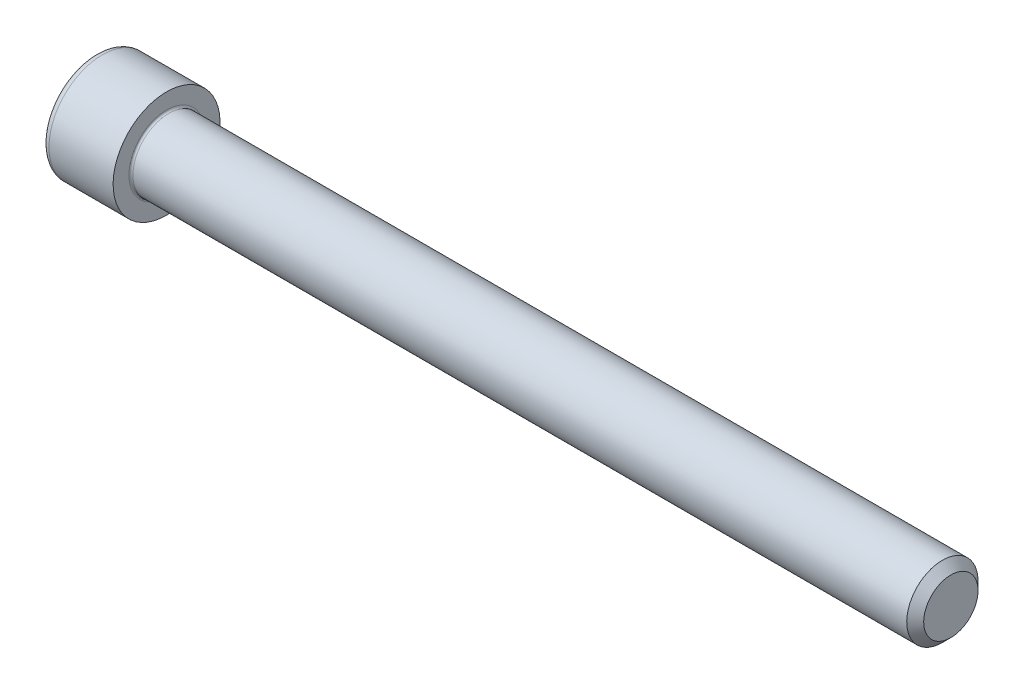
ISO-10303-21;
HEADER;
FILE_DESCRIPTION(('STEP AP214'),'2;1');
FILE_NAME('part.step','',(''),(''),'','','');
FILE_SCHEMA(('AUTOMOTIVE_DESIGN { 1 0 10303 214 1 1 1 1 }'));
ENDSEC;
DATA;
#1=APPLICATION_CONTEXT('core data for automotive mechanical design processes');
#2=APPLICATION_PROTOCOL_DEFINITION('international standard','automotive_design',2000,#1);
#3=PRODUCT_CONTEXT('',#1,'mechanical');
#4=PRODUCT('Part','Part','',(#3));
#5=PRODUCT_RELATED_PRODUCT_CATEGORY('part','',(#4));
#6=PRODUCT_DEFINITION_FORMATION('','',#4);
#7=PRODUCT_DEFINITION_CONTEXT('part definition',#1,'design');
#8=PRODUCT_DEFINITION('design','',#6,#7);
#9=PRODUCT_DEFINITION_SHAPE('','',#8);
#10=(LENGTH_UNIT() NAMED_UNIT(*) SI_UNIT(.MILLI.,.METRE.));
#11=(NAMED_UNIT(*) PLANE_ANGLE_UNIT() SI_UNIT($,.RADIAN.));
#12=(NAMED_UNIT(*) SI_UNIT($,.STERADIAN.) SOLID_ANGLE_UNIT());
#13=UNCERTAINTY_MEASURE_WITH_UNIT(LENGTH_MEASURE(1.E-05),#10,'distance_accuracy_value','');
#14=(GEOMETRIC_REPRESENTATION_CONTEXT(3) GLOBAL_UNCERTAINTY_ASSIGNED_CONTEXT((#13)) GLOBAL_UNIT_ASSIGNED_CONTEXT((#10,
#11,#12)) REPRESENTATION_CONTEXT('',''));
#15=CARTESIAN_POINT('',(0.,0.,0.));
#16=DIRECTION('',(0.,0.,1.));
#17=DIRECTION('',(1.,0.,0.));
#18=AXIS2_PLACEMENT_3D('',#15,#16,#17);
#19=CARTESIAN_POINT('',(-3.302,0.,0.));
#20=DIRECTION('',(-1.,0.,0.));
#21=DIRECTION('',(0.,-1.,0.));
#22=AXIS2_PLACEMENT_3D('',#19,#20,#21);
#23=CONICAL_SURFACE('',#22,2.7569630054343,1.0471975511966);
#24=CARTESIAN_POINT('',(-1.71026666666666,0.,0.));
#25=VERTEX_POINT('',#24);
#26=VERTEX_LOOP('',#25);
#27=FACE_BOUND('',#26,.T.);
#28=CARTESIAN_POINT('',(-3.30206667085508,0.000200000000867156,2.75707847548864));
#29=CARTESIAN_POINT('',(-3.26707753696997,-0.104723935463511,2.69650061310385));
#30=CARTESIAN_POINT('',(-3.23525591461342,-0.210553565392693,2.63539984777599));
#31=CARTESIAN_POINT('',(-3.17971030909154,-0.424045469619761,2.51214023940069));
#32=CARTESIAN_POINT('',(-3.15600597703154,-0.531711538058903,2.44997920580476));
#33=CARTESIAN_POINT('',(-3.11910584905487,-0.745709321958978,2.32642752766407));
#34=CARTESIAN_POINT('',(-3.10566447822801,-0.852008106597351,2.26505589573858));
#35=CARTESIAN_POINT('',(-3.089616747602,-1.06510598253905,2.1420237796999));
#36=CARTESIAN_POINT('',(-3.08699710051458,-1.17190429901638,2.08036374293272));
#37=CARTESIAN_POINT('',(-3.09243976092166,-1.37147185730919,1.96514335943084));
#38=CARTESIAN_POINT('',(-3.09916570852553,-1.46427093659247,1.91156578602609));
#39=CARTESIAN_POINT('',(-3.12048522514207,-1.64926449459352,1.80475970551584));
#40=CARTESIAN_POINT('',(-3.1350860806402,-1.74145833320245,1.75153156797735));
#41=CARTESIAN_POINT('',(-3.17158795953627,-1.92683347580783,1.64450517949307));
#42=CARTESIAN_POINT('',(-3.19364375098412,-2.01999131129759,1.59072047809594));
#43=CARTESIAN_POINT('',(-3.24370205803594,-2.20491735878378,1.48395337479961));
#44=CARTESIAN_POINT('',(-3.27169280762563,-2.29668794093019,1.43096960449369));
#45=CARTESIAN_POINT('',(-3.30206667085479,-2.3878,1.37836603266331));
#46=B_SPLINE_CURVE_WITH_KNOTS('',3,(#28,#29,#30,#31,#32,#33,#34,#35,#36,#37,#38,#39,#40,#41,#42,
#43,#44,#45),.UNSPECIFIED.,.F.,.F.,(4,2,2,2,2,2,2,2,4),(0.,0.378469527554716,0.757848917720246,
1.12783830118166,1.49737326355531,1.81916504067657,2.14125507699957,2.47049068028452,
2.79907957904392),.UNSPECIFIED.);
#47=CARTESIAN_POINT('',(-3.30200000001923,0.,2.7569630054343));
#48=VERTEX_POINT('',#47);
#49=CARTESIAN_POINT('',(-3.30200000001923,-2.3876,1.37848150271715));
#50=VERTEX_POINT('',#49);
#51=EDGE_CURVE('E132',#48,#50,#46,.T.);
#52=ORIENTED_EDGE('',*,*,#51,.F.);
#53=CARTESIAN_POINT('',(-3.30206667085508,2.38780000000087,1.37836603266281));
#54=CARTESIAN_POINT('',(-3.26707753696997,2.28287606453649,1.4389438950476));
#55=CARTESIAN_POINT('',(-3.23525591461342,2.17704643460731,1.50004466037545));
#56=CARTESIAN_POINT('',(-3.17971030909154,1.96355453038024,1.62330426875076));
#57=CARTESIAN_POINT('',(-3.15600597703154,1.8558884619411,1.68546530234669));
#58=CARTESIAN_POINT('',(-3.11910584905487,1.64189067804102,1.80901698048738));
#59=CARTESIAN_POINT('',(-3.10566447822801,1.53559189340265,1.87038861241287));
#60=CARTESIAN_POINT('',(-3.089616747602,1.32249401746096,1.99342072845155));
#61=CARTESIAN_POINT('',(-3.08699710051457,1.21569570098362,2.05508076521873));
#62=CARTESIAN_POINT('',(-3.09243976092166,1.01612814269081,2.17030114872061));
#63=CARTESIAN_POINT('',(-3.09916570852553,0.92332906340753,2.22387872212536));
#64=CARTESIAN_POINT('',(-3.12048522514207,0.738335505406479,2.33068480263561));
#65=CARTESIAN_POINT('',(-3.1350860806402,0.64614166679755,2.3839129401741));
#66=CARTESIAN_POINT('',(-3.17158795953627,0.460766524192175,2.49093932865838));
#67=CARTESIAN_POINT('',(-3.19364375098412,0.367608688702416,2.54472403005552));
#68=CARTESIAN_POINT('',(-3.24370205803594,0.182682641216218,2.65149113335185));
#69=CARTESIAN_POINT('',(-3.27169280762563,0.090912059069809,2.70447490365776));
#70=CARTESIAN_POINT('',(-3.30206667085479,-0.000200000000000247,2.75707847548814));
#71=B_SPLINE_CURVE_WITH_KNOTS('',3,(#53,#54,#55,#56,#57,#58,#59,#60,#61,#62,#63,#64,#65,#66,#67,
#68,#69,#70),.UNSPECIFIED.,.F.,.F.,(4,2,2,2,2,2,2,2,4),(0.,0.378469527554716,0.757848917720246,
1.12783830118166,1.49737326355531,1.81916504067657,2.14125507699957,2.47049068028452,
2.79907957904392),.UNSPECIFIED.);
#72=CARTESIAN_POINT('',(-3.30200000001923,2.3876,1.37848150271715));
#73=VERTEX_POINT('',#72);
#74=EDGE_CURVE('E116',#73,#48,#71,.T.);
#75=ORIENTED_EDGE('',*,*,#74,.F.);
#76=CARTESIAN_POINT('',(-4.18979393601053,2.3876,-3.56980849321916));
#77=CARTESIAN_POINT('',(-4.14032815892822,2.3876,-3.46670370248887));
#78=CARTESIAN_POINT('',(-4.09137617294275,2.3876,-3.36334773439772));
#79=CARTESIAN_POINT('',(-3.99479124822564,2.3876,-3.15599957257146));
#80=CARTESIAN_POINT('',(-3.94715854687756,2.3876,-3.05200726839556));
#81=CARTESIAN_POINT('',(-3.85323755548223,2.3876,-2.84265630190438));
#82=CARTESIAN_POINT('',(-3.80695917341202,2.3876,-2.73729317779475));
#83=CARTESIAN_POINT('',(-3.7164776477105,2.3876,-2.52568279122074));
#84=CARTESIAN_POINT('',(-3.67227439617584,2.3876,-2.41943557506663));
#85=CARTESIAN_POINT('',(-3.58537011973026,2.3876,-2.20308925723332));
#86=CARTESIAN_POINT('',(-3.54273858869362,2.3876,-2.09296207559753));
#87=CARTESIAN_POINT('',(-3.46101994745047,2.3876,-1.8713756399522));
#88=CARTESIAN_POINT('',(-3.42193324834409,2.3876,-1.75991623313437));
#89=CARTESIAN_POINT('',(-3.34842202238522,2.3876,-1.53574546818942));
#90=CARTESIAN_POINT('',(-3.3139867136315,2.3876,-1.42303768420966));
#91=CARTESIAN_POINT('',(-3.2509559036791,2.3876,-1.19600683622336));
#92=CARTESIAN_POINT('',(-3.22235895212225,2.3876,-1.08168418094485));
#93=CARTESIAN_POINT('',(-3.17252928890006,2.3876,-0.851661734027283));
#94=CARTESIAN_POINT('',(-3.15128145205012,2.3876,-0.735965283877574));
#95=CARTESIAN_POINT('',(-3.11754136315291,2.3876,-0.50327798756284));
#96=CARTESIAN_POINT('',(-3.10504851942715,2.3876,-0.386287229412431));
#97=CARTESIAN_POINT('',(-3.08997750794679,2.3876,-0.153060820709619));
#98=CARTESIAN_POINT('',(-3.08728234032656,2.3876,-0.0368329177291807));
#99=CARTESIAN_POINT('',(-3.09173437046107,2.3876,0.195441211734905));
#100=CARTESIAN_POINT('',(-3.09888217765583,2.3876,0.311487426523707));
#101=CARTESIAN_POINT('',(-3.11929953408256,2.3876,0.512427197188795));
#102=CARTESIAN_POINT('',(-3.13048322640562,2.3876,0.597542928135904));
#103=CARTESIAN_POINT('',(-3.15737658155532,2.3876,0.767062617315261));
#104=CARTESIAN_POINT('',(-3.1730870275181,2.3876,0.851466449785058));
#105=CARTESIAN_POINT('',(-3.22617759497026,2.3876,1.10356659989913));
#106=CARTESIAN_POINT('',(-3.26950195890938,2.3876,1.27002026330531));
#107=CARTESIAN_POINT('',(-3.34351951443674,2.3876,1.51891846693128));
#108=CARTESIAN_POINT('',(-3.37004247651047,2.3876,1.60267504477745));
#109=CARTESIAN_POINT('',(-3.42554115129612,2.3876,1.76932116385018));
#110=CARTESIAN_POINT('',(-3.45451533329899,2.3876,1.85221121038454));
#111=CARTESIAN_POINT('',(-3.51449661718128,2.3876,2.01722886079907));
#112=CARTESIAN_POINT('',(-3.54550334960868,2.3876,2.09935660016091));
#113=CARTESIAN_POINT('',(-3.60921387627046,2.3876,2.26296537207273));
#114=CARTESIAN_POINT('',(-3.64191795723008,2.3876,2.34444629266071));
#115=CARTESIAN_POINT('',(-3.72749222624701,2.3876,2.55242893230761));
#116=CARTESIAN_POINT('',(-3.78137257985246,2.3876,2.67851448309363));
#117=CARTESIAN_POINT('',(-3.89172540006839,2.3876,2.92954963732601));
#118=CARTESIAN_POINT('',(-3.94819806086299,2.3876,3.05449915483192));
#119=CARTESIAN_POINT('',(-4.06314681218863,2.3876,3.30349712860238));
#120=CARTESIAN_POINT('',(-4.12162325025623,2.3876,3.42754542399002));
#121=CARTESIAN_POINT('',(-4.24013780231262,2.3876,3.6748949368526));
#122=CARTESIAN_POINT('',(-4.30017595103082,2.3876,3.79819613763829));
#123=CARTESIAN_POINT('',(-4.48227324944979,2.3876,4.16748745488007));
#124=CARTESIAN_POINT('',(-4.60617582250528,2.3876,4.41256771633377));
#125=CARTESIAN_POINT('',(-4.85714973382894,2.3876,4.90105019175773));
#126=CARTESIAN_POINT('',(-4.98422066930818,2.3876,5.14445261405766));
#127=CARTESIAN_POINT('',(-5.22846408211094,2.38760000000001,5.60717601476413));
#128=CARTESIAN_POINT('',(-5.34543879972904,2.38760000000001,5.82660154635425));
#129=CARTESIAN_POINT('',(-5.58072000325182,2.38760000000001,6.26474684956248));
#130=CARTESIAN_POINT('',(-5.69902653844135,2.38760000000001,6.48346659467455));
#131=CARTESIAN_POINT('',(-5.93633623854322,2.38760000000001,6.91980663495284));
#132=CARTESIAN_POINT('',(-6.05533686617889,2.38760000000001,7.13742831158591));
#133=CARTESIAN_POINT('',(-6.29411264362597,2.38760000000001,7.57223168560478));
#134=CARTESIAN_POINT('',(-6.41388775257905,2.38760000000001,7.78941340541968));
#135=CARTESIAN_POINT('',(-6.53394673725325,2.38760000000001,8.00643706714307));
#136=B_SPLINE_CURVE_WITH_KNOTS('',3,(#76,#77,#78,#79,#80,#81,#82,#83,#84,#85,#86,#87,#88,#89,
#90,#91,#92,#93,#94,#95,#96,#97,#98,#99,#100,#101,#102,#103,#104,#105,#106,#107,#108,#109,#110,
#111,#112,#113,#114,#115,#116,#117,#118,#119,#120,#121,#122,#123,#124,#125,#126,#127,#128,#129,
#130,#131,#132,#133,#134,#135),.UNSPECIFIED.,.F.,.F.,(4,2,2,2,2,2,2,2,2,2,2,2,2,2,2,2,2,2,2,2,2,
2,2,2,2,2,2,2,2,4),(0.,0.343075057157598,0.686211449189029,1.03142931875567,1.37662921763736,
1.73085459772214,2.08512100552917,2.43855159209461,2.79189427270902,3.14450535144264,
3.49709259777494,3.84545529792507,4.19383956835467,4.45125430328071,4.70871359816254,
5.22402691449442,5.4875755508175,5.75096080731956,6.01429832092989,6.27768046464175,
6.68898487147716,7.10032013867147,7.51172711288516,7.92314324382324,8.74696114416905,
9.57067484251389,10.3166417000106,11.0626362538742,11.8067333547366,12.5507915153776),.UNSPECIFIED.);
#137=CARTESIAN_POINT('',(-3.30200000001923,2.3876,-1.37848150271715));
#138=VERTEX_POINT('',#137);
#139=EDGE_CURVE('E124',#138,#73,#136,.T.);
#140=ORIENTED_EDGE('',*,*,#139,.F.);
#141=CARTESIAN_POINT('',(-3.30206667085479,-0.000200000000000793,-2.75707847548814));
#142=CARTESIAN_POINT('',(-3.2670775369697,0.104723935464363,-2.69650061310335));
#143=CARTESIAN_POINT('',(-3.23525591461318,0.210553565393532,-2.63539984777551));
#144=CARTESIAN_POINT('',(-3.17971030909135,0.42404546962057,-2.51214023940022));
#145=CARTESIAN_POINT('',(-3.15600597703138,0.531711538059697,-2.44997920580431));
#146=CARTESIAN_POINT('',(-3.11910584905476,0.74570932195974,-2.32642752766363));
#147=CARTESIAN_POINT('',(-3.10566447822793,0.852008106598096,-2.26505589573815));
#148=CARTESIAN_POINT('',(-3.08961674760197,1.06510598253976,-2.14202377969949));
#149=CARTESIAN_POINT('',(-3.08699710051457,1.17190429901707,-2.08036374293232));
#150=CARTESIAN_POINT('',(-3.0924397609217,1.37147185730988,-1.96514335943045));
#151=CARTESIAN_POINT('',(-3.09916570852559,1.46427093659318,-1.91156578602568));
#152=CARTESIAN_POINT('',(-3.12048522514217,1.64926449459426,-1.80475970551541));
#153=CARTESIAN_POINT('',(-3.13508608064033,1.74145833320321,-1.75153156797691));
#154=CARTESIAN_POINT('',(-3.17158795953644,1.92683347580862,-1.64450517949262));
#155=CARTESIAN_POINT('',(-3.19364375098432,2.01999131129839,-1.59072047809547));
#156=CARTESIAN_POINT('',(-3.24370205803619,2.20491735878462,-1.48395337479912));
#157=CARTESIAN_POINT('',(-3.2716928076259,2.29668794093104,-1.4309696044932));
#158=CARTESIAN_POINT('',(-3.30206667085508,2.38780000000087,-1.37836603266281));
#159=B_SPLINE_CURVE_WITH_KNOTS('',3,(#141,#142,#143,#144,#145,#146,#147,#148,#149,#150,#151,
#152,#153,#154,#155,#156,#157,#158),.UNSPECIFIED.,.F.,.F.,(4,2,2,2,2,2,2,2,4),(0.,
0.378469527554649,0.757848917720111,1.12783830118146,1.49737326355505,1.81916504067637,
2.14125507699943,2.47049068028445,2.79907957904392),.UNSPECIFIED.);
#160=CARTESIAN_POINT('',(-3.30200000001923,0.,-2.7569630054343));
#161=VERTEX_POINT('',#160);
#162=EDGE_CURVE('E161',#161,#138,#159,.T.);
#163=ORIENTED_EDGE('',*,*,#162,.F.);
#164=CARTESIAN_POINT('',(-3.30206667085479,-2.3878,-1.37836603266331));
#165=CARTESIAN_POINT('',(-3.2670775369697,-2.28287606453564,-1.4389438950481));
#166=CARTESIAN_POINT('',(-3.23525591461318,-2.17704643460647,-1.50004466037594));
#167=CARTESIAN_POINT('',(-3.17971030909135,-1.96355453037943,-1.62330426875123));
#168=CARTESIAN_POINT('',(-3.15600597703138,-1.8558884619403,-1.68546530234715));
#169=CARTESIAN_POINT('',(-3.11910584905476,-1.64189067804026,-1.80901698048782));
#170=CARTESIAN_POINT('',(-3.10566447822793,-1.5355918934019,-1.8703886124133));
#171=CARTESIAN_POINT('',(-3.08961674760197,-1.32249401746024,-1.99342072845196));
#172=CARTESIAN_POINT('',(-3.08699710051457,-1.21569570098293,-2.05508076521914));
#173=CARTESIAN_POINT('',(-3.0924397609217,-1.01612814269012,-2.17030114872101));
#174=CARTESIAN_POINT('',(-3.09916570852559,-0.923329063406818,-2.22387872212577));
#175=CARTESIAN_POINT('',(-3.12048522514217,-0.738335505405734,-2.33068480263604));
#176=CARTESIAN_POINT('',(-3.13508608064033,-0.64614166679679,-2.38391294017454));
#177=CARTESIAN_POINT('',(-3.17158795953644,-0.460766524191383,-2.49093932865884));
#178=CARTESIAN_POINT('',(-3.19364375098432,-0.367608688701608,-2.54472403005598));
#179=CARTESIAN_POINT('',(-3.24370205803619,-0.18268264121538,-2.65149113335233));
#180=CARTESIAN_POINT('',(-3.2716928076259,-0.0909120590689566,-2.70447490365826));
#181=CARTESIAN_POINT('',(-3.30206667085508,0.000200000000867012,-2.75707847548864));
#182=B_SPLINE_CURVE_WITH_KNOTS('',3,(#164,#165,#166,#167,#168,#169,#170,#171,#172,#173,#174,
#175,#176,#177,#178,#179,#180,#181),.UNSPECIFIED.,.F.,.F.,(4,2,2,2,2,2,2,2,4),(0.,
0.37846952755465,0.757848917720111,1.12783830118146,1.49737326355505,1.81916504067637,
2.14125507699943,2.47049068028445,2.79907957904392),.UNSPECIFIED.);
#183=CARTESIAN_POINT('',(-3.30200000001923,-2.3876,-1.37848150271715));
#184=VERTEX_POINT('',#183);
#185=EDGE_CURVE('E171',#184,#161,#182,.T.);
#186=ORIENTED_EDGE('',*,*,#185,.F.);
#187=CARTESIAN_POINT('',(-4.18979393539433,-2.3876,-3.56980849193514));
#188=CARTESIAN_POINT('',(-4.14032815833856,-2.3876,-3.46670370124873));
#189=CARTESIAN_POINT('',(-4.09137617237963,-2.3876,-3.3633477332015));
#190=CARTESIAN_POINT('',(-3.99479124771542,-2.3876,-3.15599957146323));
#191=CARTESIAN_POINT('',(-3.94715854639372,-2.3876,-3.0520072673314));
#192=CARTESIAN_POINT('',(-3.85323755505119,-2.3876,-2.84265630092921));
#193=CARTESIAN_POINT('',(-3.80695917300739,-2.3876,-2.7372931768645));
#194=CARTESIAN_POINT('',(-3.71647764735817,-2.3876,-2.52568279038067));
#195=CARTESIAN_POINT('',(-3.6722743958494,-2.3876,-2.41943557427183));
#196=CARTESIAN_POINT('',(-3.58537011945578,-2.3876,-2.20308925653169));
#197=CARTESIAN_POINT('',(-3.54273858844516,-2.3876,-2.09296207494382));
#198=CARTESIAN_POINT('',(-3.46101994725245,-2.3876,-1.8713756393952));
#199=CARTESIAN_POINT('',(-3.42193324817049,-2.3876,-1.75991623262615));
#200=CARTESIAN_POINT('',(-3.34842202225778,-2.3876,-1.53574546777967));
#201=CARTESIAN_POINT('',(-3.31398671352581,-2.3876,-1.4230376838496));
#202=CARTESIAN_POINT('',(-3.25095590361284,-2.3876,-1.19600683596409));
#203=CARTESIAN_POINT('',(-3.22235895207369,-2.3876,-1.08168418073668));
#204=CARTESIAN_POINT('',(-3.17252928888399,-2.3876,-0.851661733937176));
#205=CARTESIAN_POINT('',(-3.15128145204795,-2.3876,-0.735965283854633));
#206=CARTESIAN_POINT('',(-3.11754136316811,-2.3876,-0.503277987675639));
#207=CARTESIAN_POINT('',(-3.10504851944584,-2.3876,-0.386287229593802));
#208=CARTESIAN_POINT('',(-3.08997750796041,-2.3876,-0.153060821026858));
#209=CARTESIAN_POINT('',(-3.08728234033184,-2.3876,-0.0368329181137099));
#210=CARTESIAN_POINT('',(-3.0917343704385,-2.3876,0.195441211217056));
#211=CARTESIAN_POINT('',(-3.09888217761376,-2.3876,0.311487425939827));
#212=CARTESIAN_POINT('',(-3.11929953400169,-2.3876,0.512427196518838));
#213=CARTESIAN_POINT('',(-3.130483226309,-2.3876,0.597542927445191));
#214=CARTESIAN_POINT('',(-3.15737658142634,-2.3876,0.767062616583864));
#215=CARTESIAN_POINT('',(-3.17308702737249,-2.3876,0.851466449033732));
#216=CARTESIAN_POINT('',(-3.22617759477434,-2.3876,1.10356659908891));
#217=CARTESIAN_POINT('',(-3.26950195867939,-2.3876,1.27002026245713));
#218=CARTESIAN_POINT('',(-3.34351951415623,-2.3876,1.51891846602621));
#219=CARTESIAN_POINT('',(-3.37004247621298,-2.3876,1.60267504385306));
#220=CARTESIAN_POINT('',(-3.4255411509651,-2.3876,1.76932116288732));
#221=CARTESIAN_POINT('',(-3.45451533295141,-2.3876,1.85221120940253));
#222=CARTESIAN_POINT('',(-3.51449661680109,-2.3876,2.01722885977888));
#223=CARTESIAN_POINT('',(-3.54550334921242,-2.3876,2.09935659912168));
#224=CARTESIAN_POINT('',(-3.60921387584252,-2.3876,2.2629653709954));
#225=CARTESIAN_POINT('',(-3.64191795678652,-2.3876,2.34444629156433));
#226=CARTESIAN_POINT('',(-3.72749222577887,-2.3876,2.55242893119858));
#227=CARTESIAN_POINT('',(-3.78137257937665,-2.3876,2.67851448199058));
#228=CARTESIAN_POINT('',(-3.89172539957937,-2.3876,2.92954963623418));
#229=CARTESIAN_POINT('',(-3.94819806036842,-2.3876,3.05449915374533));
#230=CARTESIAN_POINT('',(-4.06314681168454,-2.3876,3.30349712752572));
#231=CARTESIAN_POINT('',(-4.12162324974816,-2.3876,3.42754542291805));
#232=CARTESIAN_POINT('',(-4.24013780179773,-2.3876,3.67489493578953));
#233=CARTESIAN_POINT('',(-4.30017595051309,-2.3876,3.79819613657944));
#234=CARTESIAN_POINT('',(-4.48227324892495,-2.3876,4.16748745383371));
#235=CARTESIAN_POINT('',(-4.60617582197744,-2.3876,4.41256771529512));
#236=CARTESIAN_POINT('',(-4.85714973329697,-2.3876,4.90105019073353));
#237=CARTESIAN_POINT('',(-4.98422066877507,-2.3876,5.1444526130402));
#238=CARTESIAN_POINT('',(-5.22846408157355,-2.3876,5.6071760137528));
#239=CARTESIAN_POINT('',(-5.34543879918833,-2.3876,5.82660154534239));
#240=CARTESIAN_POINT('',(-5.58072000270509,-2.3876,6.26474684854928));
#241=CARTESIAN_POINT('',(-5.69902653789189,-2.3876,6.48346659366054));
#242=CARTESIAN_POINT('',(-5.93633623798832,-2.3876,6.91980663393626));
#243=CARTESIAN_POINT('',(-6.05533686562126,-2.3876,7.13742831056756));
#244=CARTESIAN_POINT('',(-6.29411264306315,-2.3876,7.57223168458274));
#245=CARTESIAN_POINT('',(-6.41388775201377,-2.3876,7.7894134043957));
#246=CARTESIAN_POINT('',(-6.53394673668561,-2.3876,8.00643706611711));
#247=B_SPLINE_CURVE_WITH_KNOTS('',3,(#187,#188,#189,#190,#191,#192,#193,#194,#195,#196,#197,
#198,#199,#200,#201,#202,#203,#204,#205,#206,#207,#208,#209,#210,#211,#212,#213,#214,#215,#216,
#217,#218,#219,#220,#221,#222,#223,#224,#225,#226,#227,#228,#229,#230,#231,#232,#233,#234,#235,
#236,#237,#238,#239,#240,#241,#242,#243,#244,#245,#246),.UNSPECIFIED.,.F.,.F.,(4,2,2,2,2,2,2,2,
2,2,2,2,2,2,2,2,2,2,2,2,2,2,2,2,2,2,2,2,2,4),(0.,0.34307505700446,0.686211448882728,
1.03142931829414,1.3766292170206,1.73085459694314,2.08512100458788,2.43855159099179,
2.79189427144481,3.14450534997319,3.49709259610053,3.84545529605018,4.19383956627911,
4.45125430113727,4.70871359595121,5.22402691214698,5.48757554839938,5.75096080483082,
6.01429831837067,6.27768046201202,6.6889848688548,7.10032013605655,7.51172711027786,
7.92314324122357,8.74696114158591,9.57067483994708,10.3166416974377,11.0626362512953,
11.8067333521491,12.5507915127815),.UNSPECIFIED.);
#248=EDGE_CURVE('E174',#50,#184,#247,.F.);
#249=ORIENTED_EDGE('',*,*,#248,.F.);
#250=EDGE_LOOP('',(#52,#75,#140,#163,#186,#249));
#251=FACE_BOUND('',#250,.T.);
#252=ADVANCED_FACE('F60',(#27,#251),#23,.F.);
#253=CARTESIAN_POINT('',(69.85,0.,0.));
#254=DIRECTION('',(-1.,0.,0.));
#255=DIRECTION('',(0.,-1.,0.));
#256=AXIS2_PLACEMENT_3D('',#253,#254,#255);
#257=PLANE('',#256);
#258=CARTESIAN_POINT('',(69.85,0.,0.));
#259=DIRECTION('',(-1.,0.,0.));
#260=DIRECTION('',(0.,-1.,0.));
#261=AXIS2_PLACEMENT_3D('',#258,#259,#260);
#262=CIRCLE('',#261,2.41935000000001);
#263=CARTESIAN_POINT('',(69.85,-2.41935000000001,0.));
#264=VERTEX_POINT('',#263);
#265=EDGE_CURVE('E247',#264,#264,#262,.F.);
#266=ORIENTED_EDGE('',*,*,#265,.T.);
#267=EDGE_LOOP('',(#266));
#268=FACE_BOUND('',#267,.T.);
#269=ADVANCED_FACE('F227',(#268),#257,.F.);
#270=CARTESIAN_POINT('',(-1.71026666666666,0.,0.));
#271=DIRECTION('',(-1.,0.,0.));
#272=DIRECTION('',(0.,-1.,0.));
#273=AXIS2_PLACEMENT_3D('',#270,#271,#272);
#274=CYLINDRICAL_SURFACE('',#273,3.175);
#275=CARTESIAN_POINT('',(0.177800000000003,0.,0.));
#276=DIRECTION('',(-1.,0.,0.));
#277=DIRECTION('',(0.,-1.,0.));
#278=AXIS2_PLACEMENT_3D('',#275,#276,#277);
#279=CIRCLE('',#278,3.175);
#280=CARTESIAN_POINT('',(0.177800000000003,-3.175,0.));
#281=VERTEX_POINT('',#280);
#282=EDGE_CURVE('E12',#281,#281,#279,.F.);
#283=ORIENTED_EDGE('',*,*,#282,.T.);
#284=EDGE_LOOP('',(#283));
#285=FACE_BOUND('',#284,.T.);
#286=CARTESIAN_POINT('',(69.09435,0.,0.));
#287=DIRECTION('',(-1.,0.,0.));
#288=DIRECTION('',(0.,-1.,0.));
#289=AXIS2_PLACEMENT_3D('',#286,#287,#288);
#290=CIRCLE('',#289,3.175);
#291=CARTESIAN_POINT('',(69.09435,-3.175,0.));
#292=VERTEX_POINT('',#291);
#293=EDGE_CURVE('E250',#292,#292,#290,.T.);
#294=ORIENTED_EDGE('',*,*,#293,.T.);
#295=EDGE_LOOP('',(#294));
#296=FACE_BOUND('',#295,.T.);
#297=ADVANCED_FACE('F223',(#285,#296),#274,.T.);
#298=CARTESIAN_POINT('',(0.,3.175,0.));
#299=DIRECTION('',(-1.,0.,0.));
#300=DIRECTION('',(0.,-1.,0.));
#301=AXIS2_PLACEMENT_3D('',#298,#299,#300);
#302=PLANE('',#301);
#303=CARTESIAN_POINT('',(0.,0.,0.));
#304=DIRECTION('',(-1.,0.,0.));
#305=DIRECTION('',(0.,-1.,0.));
#306=AXIS2_PLACEMENT_3D('',#303,#304,#305);
#307=CIRCLE('',#306,3.3528);
#308=CARTESIAN_POINT('',(0.,-3.3528,0.));
#309=VERTEX_POINT('',#308);
#310=EDGE_CURVE('E68',#309,#309,#307,.T.);
#311=ORIENTED_EDGE('',*,*,#310,.T.);
#312=EDGE_LOOP('',(#311));
#313=FACE_BOUND('',#312,.T.);
#314=CARTESIAN_POINT('',(0.,0.,0.));
#315=DIRECTION('',(-1.,0.,0.));
#316=DIRECTION('',(0.,-1.,0.));
#317=AXIS2_PLACEMENT_3D('',#314,#315,#316);
#318=CIRCLE('',#317,4.7625);
#319=CARTESIAN_POINT('',(0.,-4.7625,0.));
#320=VERTEX_POINT('',#319);
#321=EDGE_CURVE('E265',#320,#320,#318,.T.);
#322=ORIENTED_EDGE('',*,*,#321,.F.);
#323=EDGE_LOOP('',(#322));
#324=FACE_BOUND('',#323,.T.);
#325=ADVANCED_FACE('F219',(#313,#324),#302,.F.);
#326=CARTESIAN_POINT('',(-1.71026666666666,0.,0.));
#327=DIRECTION('',(-1.,0.,0.));
#328=DIRECTION('',(0.,-1.,0.));
#329=AXIS2_PLACEMENT_3D('',#326,#327,#328);
#330=CYLINDRICAL_SURFACE('',#329,4.7625);
#331=CARTESIAN_POINT('',(-5.715,0.,0.));
#332=DIRECTION('',(1.,0.,0.));
#333=DIRECTION('',(0.,1.,0.));
#334=AXIS2_PLACEMENT_3D('',#331,#332,#333);
#335=CIRCLE('',#334,4.7625);
#336=CARTESIAN_POINT('',(-5.715,4.7625,0.));
#337=VERTEX_POINT('',#336);
#338=EDGE_CURVE('E252',#337,#337,#335,.T.);
#339=ORIENTED_EDGE('',*,*,#338,.T.);
#340=EDGE_LOOP('',(#339));
#341=FACE_BOUND('',#340,.T.);
#342=ORIENTED_EDGE('',*,*,#321,.T.);
#343=EDGE_LOOP('',(#342));
#344=FACE_BOUND('',#343,.T.);
#345=ADVANCED_FACE('F215',(#341,#344),#330,.T.);
#346=CARTESIAN_POINT('',(-6.35,4.7625,0.));
#347=DIRECTION('',(1.,0.,0.));
#348=DIRECTION('',(0.,1.,0.));
#349=AXIS2_PLACEMENT_3D('',#346,#347,#348);
#350=PLANE('',#349);
#351=CARTESIAN_POINT('',(-6.35,0.,0.));
#352=DIRECTION('',(1.,0.,0.));
#353=DIRECTION('',(0.,1.,0.));
#354=AXIS2_PLACEMENT_3D('',#351,#352,#353);
#355=CIRCLE('',#354,4.1275);
#356=CARTESIAN_POINT('',(-6.35,4.1275,0.));
#357=VERTEX_POINT('',#356);
#358=EDGE_CURVE('E256',#357,#357,#355,.F.);
#359=ORIENTED_EDGE('',*,*,#358,.T.);
#360=EDGE_LOOP('',(#359));
#361=FACE_BOUND('',#360,.T.);
#362=DIRECTION('',(0.,0.,1.));
#363=VECTOR('',#362,1.);
#364=CARTESIAN_POINT('',(-6.35,2.3876,0.));
#365=LINE('',#364,#363);
#366=CARTESIAN_POINT('',(-6.35,2.3876,-1.37848150271715));
#367=VERTEX_POINT('',#366);
#368=CARTESIAN_POINT('',(-6.35,2.3876,1.37848150271715));
#369=VERTEX_POINT('',#368);
#370=EDGE_CURVE('E123',#367,#369,#365,.T.);
#371=ORIENTED_EDGE('',*,*,#370,.T.);
#372=DIRECTION('',(0.,-0.866025403784438,0.500000000000001));
#373=VECTOR('',#372,1.);
#374=CARTESIAN_POINT('',(-6.35,1.1938,2.06772225407572));
#375=LINE('',#374,#373);
#376=CARTESIAN_POINT('',(-6.35,0.,2.7569630054343));
#377=VERTEX_POINT('',#376);
#378=EDGE_CURVE('E119',#369,#377,#375,.T.);
#379=ORIENTED_EDGE('',*,*,#378,.T.);
#380=DIRECTION('',(0.,-0.866025403784439,-0.5));
#381=VECTOR('',#380,1.);
#382=CARTESIAN_POINT('',(-6.35,-1.1938,2.06772225407573));
#383=LINE('',#382,#381);
#384=CARTESIAN_POINT('',(-6.35,-2.3876,1.37848150271715));
#385=VERTEX_POINT('',#384);
#386=EDGE_CURVE('E205',#377,#385,#383,.T.);
#387=ORIENTED_EDGE('',*,*,#386,.T.);
#388=DIRECTION('',(0.,0.,-1.));
#389=VECTOR('',#388,1.);
#390=CARTESIAN_POINT('',(-6.35,-2.3876,0.));
#391=LINE('',#390,#389);
#392=CARTESIAN_POINT('',(-6.35,-2.3876,-1.37848150271715));
#393=VERTEX_POINT('',#392);
#394=EDGE_CURVE('E75',#385,#393,#391,.T.);
#395=ORIENTED_EDGE('',*,*,#394,.T.);
#396=DIRECTION('',(0.,0.866025403784439,-0.5));
#397=VECTOR('',#396,1.);
#398=CARTESIAN_POINT('',(-6.35,-1.1938,-2.06772225407573));
#399=LINE('',#398,#397);
#400=CARTESIAN_POINT('',(-6.35,0.,-2.7569630054343));
#401=VERTEX_POINT('',#400);
#402=EDGE_CURVE('E170',#393,#401,#399,.T.);
#403=ORIENTED_EDGE('',*,*,#402,.T.);
#404=DIRECTION('',(0.,0.866025403784439,0.5));
#405=VECTOR('',#404,1.);
#406=CARTESIAN_POINT('',(-6.35,1.1938,-2.06772225407573));
#407=LINE('',#406,#405);
#408=EDGE_CURVE('E166',#401,#367,#407,.T.);
#409=ORIENTED_EDGE('',*,*,#408,.T.);
#410=EDGE_LOOP('',(#371,#379,#387,#395,#403,#409));
#411=FACE_BOUND('',#410,.T.);
#412=ADVANCED_FACE('F211',(#361,#411),#350,.F.);
#413=CARTESIAN_POINT('',(500000.,-1.19379999999913,2.06772225407573));
#414=DIRECTION('',(0.,0.5,-0.866025403784439));
#415=DIRECTION('',(0.,0.866025403784439,0.5));
#416=AXIS2_PLACEMENT_3D('',#413,#414,#415);
#417=PLANE('',#416);
#418=DIRECTION('',(-1.,0.,0.));
#419=VECTOR('',#418,1.);
#420=CARTESIAN_POINT('',(500000.,8.67155913047979E-13,2.7569630054343));
#421=LINE('',#420,#419);
#422=EDGE_CURVE('E270',#48,#377,#421,.T.);
#423=ORIENTED_EDGE('',*,*,#422,.F.);
#424=ORIENTED_EDGE('',*,*,#51,.T.);
#425=DIRECTION('',(-1.,0.,0.));
#426=VECTOR('',#425,1.);
#427=CARTESIAN_POINT('',(500000.,-2.38759999999913,1.37848150271715));
#428=LINE('',#427,#426);
#429=EDGE_CURVE('E204',#50,#385,#428,.T.);
#430=ORIENTED_EDGE('',*,*,#429,.T.);
#431=ORIENTED_EDGE('',*,*,#386,.F.);
#432=EDGE_LOOP('',(#423,#424,#430,#431));
#433=FACE_BOUND('',#432,.T.);
#434=ADVANCED_FACE('F190',(#433),#417,.T.);
#435=CARTESIAN_POINT('',(500000.,-2.38759999999913,0.));
#436=DIRECTION('',(0.,1.,0.));
#437=DIRECTION('',(0.,0.,1.));
#438=AXIS2_PLACEMENT_3D('',#435,#436,#437);
#439=PLANE('',#438);
#440=ORIENTED_EDGE('',*,*,#429,.F.);
#441=ORIENTED_EDGE('',*,*,#248,.T.);
#442=DIRECTION('',(-1.,0.,0.));
#443=VECTOR('',#442,1.);
#444=CARTESIAN_POINT('',(500000.,-2.38759999999913,-1.37848150271715));
#445=LINE('',#444,#443);
#446=EDGE_CURVE('E181',#184,#393,#445,.T.);
#447=ORIENTED_EDGE('',*,*,#446,.T.);
#448=ORIENTED_EDGE('',*,*,#394,.F.);
#449=EDGE_LOOP('',(#440,#441,#447,#448));
#450=FACE_BOUND('',#449,.T.);
#451=ADVANCED_FACE('F186',(#450),#439,.T.);
#452=CARTESIAN_POINT('',(500000.,-1.19379999999913,-2.06772225407573));
#453=DIRECTION('',(0.,0.5,0.866025403784439));
#454=DIRECTION('',(0.,-0.866025403784439,0.5));
#455=AXIS2_PLACEMENT_3D('',#452,#453,#454);
#456=PLANE('',#455);
#457=ORIENTED_EDGE('',*,*,#446,.F.);
#458=ORIENTED_EDGE('',*,*,#185,.T.);
#459=DIRECTION('',(-1.,0.,0.));
#460=VECTOR('',#459,1.);
#461=CARTESIAN_POINT('',(500000.,8.66722232178985E-13,-2.7569630054343));
#462=LINE('',#461,#460);
#463=EDGE_CURVE('E167',#161,#401,#462,.T.);
#464=ORIENTED_EDGE('',*,*,#463,.T.);
#465=ORIENTED_EDGE('',*,*,#402,.F.);
#466=EDGE_LOOP('',(#457,#458,#464,#465));
#467=FACE_BOUND('',#466,.T.);
#468=ADVANCED_FACE('F156',(#467),#456,.T.);
#469=CARTESIAN_POINT('',(500000.,1.19380000000087,-2.06772225407573));
#470=DIRECTION('',(0.,-0.5,0.866025403784439));
#471=DIRECTION('',(0.,-0.866025403784439,-0.5));
#472=AXIS2_PLACEMENT_3D('',#469,#470,#471);
#473=PLANE('',#472);
#474=ORIENTED_EDGE('',*,*,#463,.F.);
#475=ORIENTED_EDGE('',*,*,#162,.T.);
#476=DIRECTION('',(-1.,0.,0.));
#477=VECTOR('',#476,1.);
#478=CARTESIAN_POINT('',(500000.,2.38760000000087,-1.37848150271715));
#479=LINE('',#478,#477);
#480=EDGE_CURVE('E137',#138,#367,#479,.T.);
#481=ORIENTED_EDGE('',*,*,#480,.T.);
#482=ORIENTED_EDGE('',*,*,#408,.F.);
#483=EDGE_LOOP('',(#474,#475,#481,#482));
#484=FACE_BOUND('',#483,.T.);
#485=ADVANCED_FACE('F152',(#484),#473,.T.);
#486=CARTESIAN_POINT('',(500000.,2.38760000000087,0.));
#487=DIRECTION('',(0.,-1.,0.));
#488=DIRECTION('',(0.,0.,-1.));
#489=AXIS2_PLACEMENT_3D('',#486,#487,#488);
#490=PLANE('',#489);
#491=ORIENTED_EDGE('',*,*,#480,.F.);
#492=ORIENTED_EDGE('',*,*,#139,.T.);
#493=DIRECTION('',(-1.,0.,0.));
#494=VECTOR('',#493,1.);
#495=CARTESIAN_POINT('',(500000.,2.38760000000087,1.37848150271715));
#496=LINE('',#495,#494);
#497=EDGE_CURVE('E113',#73,#369,#496,.T.);
#498=ORIENTED_EDGE('',*,*,#497,.T.);
#499=ORIENTED_EDGE('',*,*,#370,.F.);
#500=EDGE_LOOP('',(#491,#492,#498,#499));
#501=FACE_BOUND('',#500,.T.);
#502=ADVANCED_FACE('F135',(#501),#490,.T.);
#503=CARTESIAN_POINT('',(500000.,1.19380000000087,2.06772225407572));
#504=DIRECTION('',(0.,-0.500000000000001,-0.866025403784438));
#505=DIRECTION('',(0.,0.866025403784438,-0.500000000000001));
#506=AXIS2_PLACEMENT_3D('',#503,#504,#505);
#507=PLANE('',#506);
#508=ORIENTED_EDGE('',*,*,#497,.F.);
#509=ORIENTED_EDGE('',*,*,#74,.T.);
#510=ORIENTED_EDGE('',*,*,#422,.T.);
#511=ORIENTED_EDGE('',*,*,#378,.F.);
#512=EDGE_LOOP('',(#508,#509,#510,#511));
#513=FACE_BOUND('',#512,.T.);
#514=ADVANCED_FACE('F115',(#513),#507,.T.);
#515=CARTESIAN_POINT('',(-5.715,0.,0.));
#516=DIRECTION('',(1.,0.,0.));
#517=DIRECTION('',(0.,1.,0.));
#518=AXIS2_PLACEMENT_3D('',#515,#516,#517);
#519=TOROIDAL_SURFACE('',#518,4.1275,0.635);
#520=ORIENTED_EDGE('',*,*,#338,.F.);
#521=EDGE_LOOP('',(#520));
#522=FACE_BOUND('',#521,.T.);
#523=ORIENTED_EDGE('',*,*,#358,.F.);
#524=EDGE_LOOP('',(#523));
#525=FACE_BOUND('',#524,.T.);
#526=ADVANCED_FACE('F234',(#522,#525),#519,.T.);
#527=CARTESIAN_POINT('',(69.09435,0.,0.));
#528=DIRECTION('',(-1.,0.,0.));
#529=DIRECTION('',(0.,-1.,0.));
#530=AXIS2_PLACEMENT_3D('',#527,#528,#529);
#531=CONICAL_SURFACE('',#530,3.175,0.785398163397462);
#532=ORIENTED_EDGE('',*,*,#265,.F.);
#533=EDGE_LOOP('',(#532));
#534=FACE_BOUND('',#533,.T.);
#535=ORIENTED_EDGE('',*,*,#293,.F.);
#536=EDGE_LOOP('',(#535));
#537=FACE_BOUND('',#536,.T.);
#538=ADVANCED_FACE('F236',(#534,#537),#531,.T.);
#539=CARTESIAN_POINT('',(0.177800000000003,0.,0.));
#540=DIRECTION('',(-1.,0.,0.));
#541=DIRECTION('',(0.,-1.,0.));
#542=AXIS2_PLACEMENT_3D('',#539,#540,#541);
#543=TOROIDAL_SURFACE('',#542,3.3528,0.1778);
#544=ORIENTED_EDGE('',*,*,#282,.F.);
#545=EDGE_LOOP('',(#544));
#546=FACE_BOUND('',#545,.T.);
#547=ORIENTED_EDGE('',*,*,#310,.F.);
#548=EDGE_LOOP('',(#547));
#549=FACE_BOUND('',#548,.T.);
#550=ADVANCED_FACE('F62',(#546,#549),#543,.F.);
#551=CLOSED_SHELL('',(#252,#269,#297,#325,#345,#412,#434,#451,#468,#485,#502,#514,#526,#538,#550));
#552=MANIFOLD_SOLID_BREP('B2',#551);
#553=ADVANCED_BREP_SHAPE_REPRESENTATION('',(#18,#552),#14);
#554=SHAPE_DEFINITION_REPRESENTATION(#9,#553);
ENDSEC;
END-ISO-10303-21;
